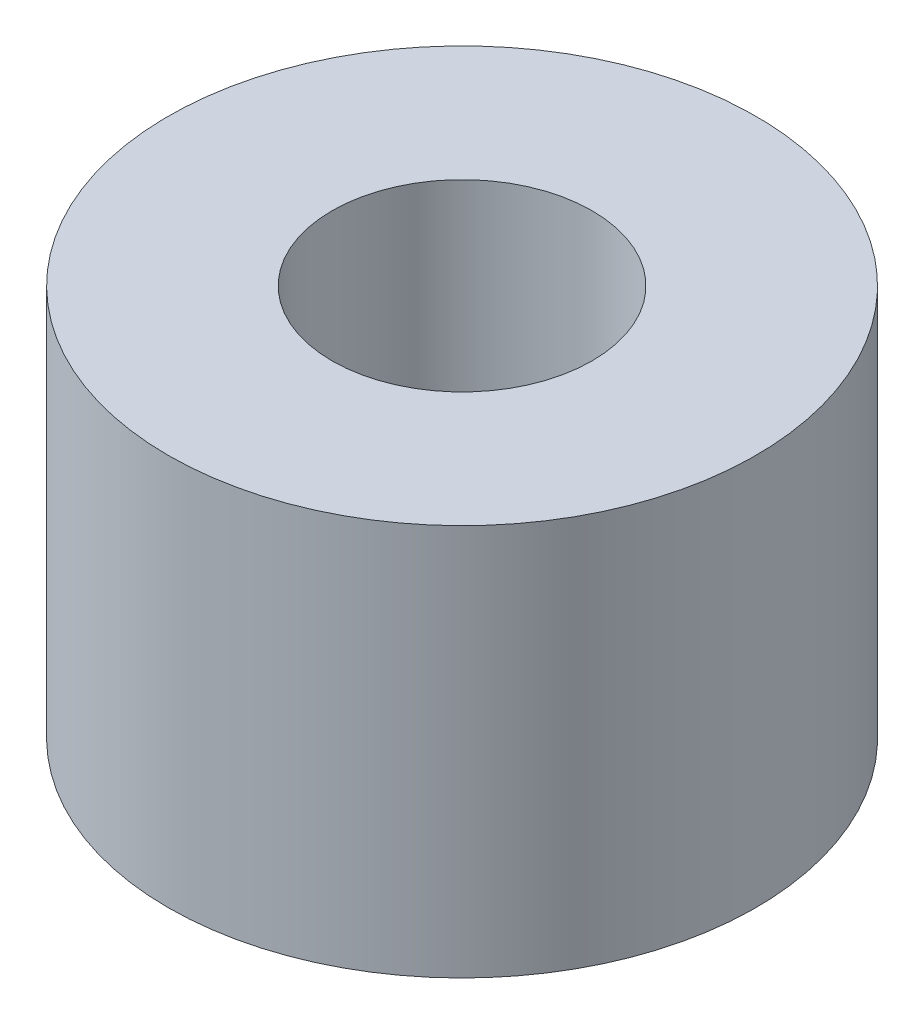
ISO-10303-21;
HEADER;
FILE_DESCRIPTION(('STEP AP214'),'2;1');
FILE_NAME('part.step','',(''),(''),'','','');
FILE_SCHEMA(('AUTOMOTIVE_DESIGN { 1 0 10303 214 1 1 1 1 }'));
ENDSEC;
DATA;
#1=APPLICATION_CONTEXT('core data for automotive mechanical design processes');
#2=APPLICATION_PROTOCOL_DEFINITION('international standard','automotive_design',2000,#1);
#3=PRODUCT_CONTEXT('',#1,'mechanical');
#4=PRODUCT('Part','Part','',(#3));
#5=PRODUCT_RELATED_PRODUCT_CATEGORY('part','',(#4));
#6=PRODUCT_DEFINITION_FORMATION('','',#4);
#7=PRODUCT_DEFINITION_CONTEXT('part definition',#1,'design');
#8=PRODUCT_DEFINITION('design','',#6,#7);
#9=PRODUCT_DEFINITION_SHAPE('','',#8);
#10=(LENGTH_UNIT() NAMED_UNIT(*) SI_UNIT(.MILLI.,.METRE.));
#11=(NAMED_UNIT(*) PLANE_ANGLE_UNIT() SI_UNIT($,.RADIAN.));
#12=(NAMED_UNIT(*) SI_UNIT($,.STERADIAN.) SOLID_ANGLE_UNIT());
#13=UNCERTAINTY_MEASURE_WITH_UNIT(LENGTH_MEASURE(1.E-05),#10,'distance_accuracy_value','');
#14=(GEOMETRIC_REPRESENTATION_CONTEXT(3) GLOBAL_UNCERTAINTY_ASSIGNED_CONTEXT((#13)) GLOBAL_UNIT_ASSIGNED_CONTEXT((#10,
#11,#12)) REPRESENTATION_CONTEXT('',''));
#15=CARTESIAN_POINT('',(0.,0.,0.));
#16=DIRECTION('',(0.,0.,1.));
#17=DIRECTION('',(1.,0.,0.));
#18=AXIS2_PLACEMENT_3D('',#15,#16,#17);
#19=CARTESIAN_POINT('',(0.,6.35,0.));
#20=DIRECTION('',(0.,1.,0.));
#21=DIRECTION('',(0.,0.,1.));
#22=AXIS2_PLACEMENT_3D('',#19,#20,#21);
#23=PLANE('',#22);
#24=CARTESIAN_POINT('',(0.,6.35,0.));
#25=DIRECTION('',(0.,1.,0.));
#26=DIRECTION('',(0.,0.,1.));
#27=AXIS2_PLACEMENT_3D('',#24,#25,#26);
#28=CIRCLE('',#27,4.7625);
#29=CARTESIAN_POINT('',(0.,6.35,4.7625));
#30=VERTEX_POINT('',#29);
#31=EDGE_CURVE('E10',#30,#30,#28,.T.);
#32=ORIENTED_EDGE('',*,*,#31,.T.);
#33=EDGE_LOOP('',(#32));
#34=FACE_BOUND('',#33,.T.);
#35=CARTESIAN_POINT('',(0.,6.35,0.));
#36=DIRECTION('',(0.,1.,0.));
#37=DIRECTION('',(0.,0.,1.));
#38=AXIS2_PLACEMENT_3D('',#35,#36,#37);
#39=CIRCLE('',#38,2.1082);
#40=CARTESIAN_POINT('',(0.,6.35,2.1082));
#41=VERTEX_POINT('',#40);
#42=EDGE_CURVE('E50',#41,#41,#39,.T.);
#43=ORIENTED_EDGE('',*,*,#42,.F.);
#44=EDGE_LOOP('',(#43));
#45=FACE_BOUND('',#44,.T.);
#46=ADVANCED_FACE('F37',(#34,#45),#23,.T.);
#47=CARTESIAN_POINT('',(0.,0.,0.));
#48=DIRECTION('',(0.,1.,0.));
#49=DIRECTION('',(0.,0.,1.));
#50=AXIS2_PLACEMENT_3D('',#47,#48,#49);
#51=PLANE('',#50);
#52=CARTESIAN_POINT('',(0.,0.,0.));
#53=DIRECTION('',(0.,1.,0.));
#54=DIRECTION('',(0.,0.,1.));
#55=AXIS2_PLACEMENT_3D('',#52,#53,#54);
#56=CIRCLE('',#55,4.7625);
#57=CARTESIAN_POINT('',(0.,0.,4.7625));
#58=VERTEX_POINT('',#57);
#59=EDGE_CURVE('E41',#58,#58,#56,.T.);
#60=ORIENTED_EDGE('',*,*,#59,.F.);
#61=EDGE_LOOP('',(#60));
#62=FACE_BOUND('',#61,.T.);
#63=CARTESIAN_POINT('',(0.,0.,0.));
#64=DIRECTION('',(0.,1.,0.));
#65=DIRECTION('',(0.,0.,1.));
#66=AXIS2_PLACEMENT_3D('',#63,#64,#65);
#67=CIRCLE('',#66,2.1082);
#68=CARTESIAN_POINT('',(0.,0.,2.1082));
#69=VERTEX_POINT('',#68);
#70=EDGE_CURVE('E52',#69,#69,#67,.T.);
#71=ORIENTED_EDGE('',*,*,#70,.T.);
#72=EDGE_LOOP('',(#71));
#73=FACE_BOUND('',#72,.T.);
#74=ADVANCED_FACE('F64',(#62,#73),#51,.F.);
#75=CARTESIAN_POINT('',(0.,6.35,0.));
#76=DIRECTION('',(0.,-1.,0.));
#77=DIRECTION('',(0.,0.,-1.));
#78=AXIS2_PLACEMENT_3D('',#75,#76,#77);
#79=CYLINDRICAL_SURFACE('',#78,4.7625);
#80=ORIENTED_EDGE('',*,*,#31,.F.);
#81=EDGE_LOOP('',(#80));
#82=FACE_BOUND('',#81,.T.);
#83=ORIENTED_EDGE('',*,*,#59,.T.);
#84=EDGE_LOOP('',(#83));
#85=FACE_BOUND('',#84,.T.);
#86=ADVANCED_FACE('F39',(#82,#85),#79,.T.);
#87=CARTESIAN_POINT('',(0.,6.35,0.));
#88=DIRECTION('',(0.,-1.,0.));
#89=DIRECTION('',(0.,0.,-1.));
#90=AXIS2_PLACEMENT_3D('',#87,#88,#89);
#91=CYLINDRICAL_SURFACE('',#90,2.1082);
#92=ORIENTED_EDGE('',*,*,#42,.T.);
#93=EDGE_LOOP('',(#92));
#94=FACE_BOUND('',#93,.T.);
#95=ORIENTED_EDGE('',*,*,#70,.F.);
#96=EDGE_LOOP('',(#95));
#97=FACE_BOUND('',#96,.T.);
#98=ADVANCED_FACE('F60',(#94,#97),#91,.F.);
#99=CLOSED_SHELL('',(#46,#74,#86,#98));
#100=MANIFOLD_SOLID_BREP('B2',#99);
#101=ADVANCED_BREP_SHAPE_REPRESENTATION('',(#18,#100),#14);
#102=SHAPE_DEFINITION_REPRESENTATION(#9,#101);
ENDSEC;
END-ISO-10303-21;
